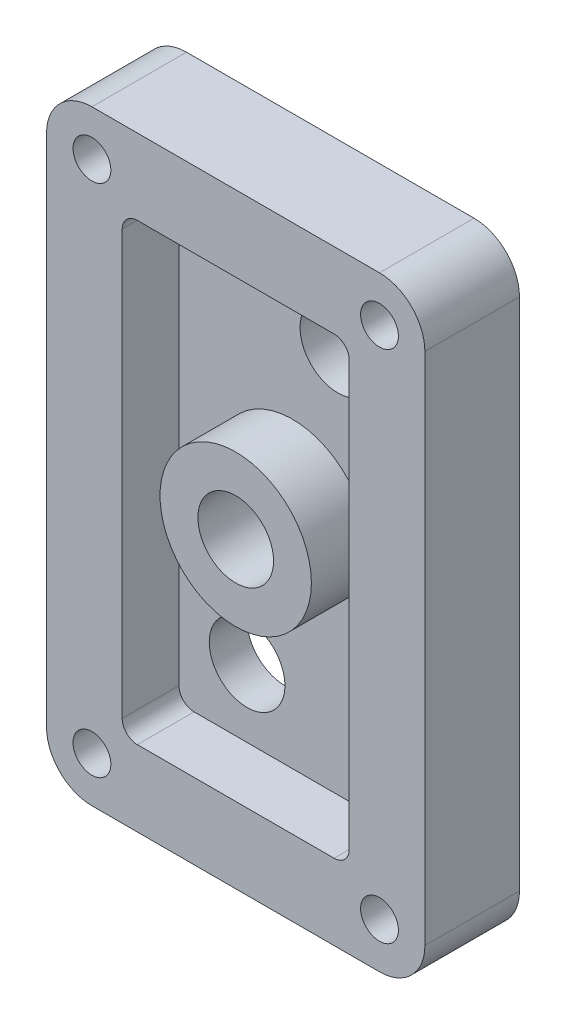
ISO-10303-21;
HEADER;
FILE_DESCRIPTION(('STEP AP214'),'2;1');
FILE_NAME('part.step','',(''),(''),'','','');
FILE_SCHEMA(('AUTOMOTIVE_DESIGN { 1 0 10303 214 1 1 1 1 }'));
ENDSEC;
DATA;
#1=APPLICATION_CONTEXT('core data for automotive mechanical design processes');
#2=APPLICATION_PROTOCOL_DEFINITION('international standard','automotive_design',2000,#1);
#3=PRODUCT_CONTEXT('',#1,'mechanical');
#4=PRODUCT('Part','Part','',(#3));
#5=PRODUCT_RELATED_PRODUCT_CATEGORY('part','',(#4));
#6=PRODUCT_DEFINITION_FORMATION('','',#4);
#7=PRODUCT_DEFINITION_CONTEXT('part definition',#1,'design');
#8=PRODUCT_DEFINITION('design','',#6,#7);
#9=PRODUCT_DEFINITION_SHAPE('','',#8);
#10=(LENGTH_UNIT() NAMED_UNIT(*) SI_UNIT(.MILLI.,.METRE.));
#11=(NAMED_UNIT(*) PLANE_ANGLE_UNIT() SI_UNIT($,.RADIAN.));
#12=(NAMED_UNIT(*) SI_UNIT($,.STERADIAN.) SOLID_ANGLE_UNIT());
#13=UNCERTAINTY_MEASURE_WITH_UNIT(LENGTH_MEASURE(1.E-05),#10,'distance_accuracy_value','');
#14=(GEOMETRIC_REPRESENTATION_CONTEXT(3) GLOBAL_UNCERTAINTY_ASSIGNED_CONTEXT((#13)) GLOBAL_UNIT_ASSIGNED_CONTEXT((#10,
#11,#12)) REPRESENTATION_CONTEXT('',''));
#15=CARTESIAN_POINT('',(0.,0.,0.));
#16=DIRECTION('',(0.,0.,1.));
#17=DIRECTION('',(1.,0.,0.));
#18=AXIS2_PLACEMENT_3D('',#15,#16,#17);
#19=CARTESIAN_POINT('',(0.,0.,250.));
#20=DIRECTION('',(0.,0.,1.));
#21=DIRECTION('',(1.,0.,0.));
#22=AXIS2_PLACEMENT_3D('',#19,#20,#21);
#23=PLANE('',#22);
#24=CARTESIAN_POINT('',(500.,800.,250.));
#25=DIRECTION('',(0.,0.,1.));
#26=DIRECTION('',(1.,0.,0.));
#27=AXIS2_PLACEMENT_3D('',#24,#25,#26);
#28=CIRCLE('',#27,100.);
#29=CARTESIAN_POINT('',(600.,800.,250.));
#30=VERTEX_POINT('',#29);
#31=EDGE_CURVE('E294',#30,#30,#28,.T.);
#32=ORIENTED_EDGE('',*,*,#31,.F.);
#33=EDGE_LOOP('',(#32));
#34=FACE_BOUND('',#33,.T.);
#35=CARTESIAN_POINT('',(500.,800.,250.));
#36=DIRECTION('',(0.,0.,1.));
#37=DIRECTION('',(1.,0.,0.));
#38=AXIS2_PLACEMENT_3D('',#35,#36,#37);
#39=CIRCLE('',#38,200.);
#40=CARTESIAN_POINT('',(700.,800.,250.));
#41=VERTEX_POINT('',#40);
#42=EDGE_CURVE('E190',#41,#41,#39,.T.);
#43=ORIENTED_EDGE('',*,*,#42,.T.);
#44=EDGE_LOOP('',(#43));
#45=FACE_BOUND('',#44,.T.);
#46=ADVANCED_FACE('F41',(#34,#45),#23,.T.);
#47=CARTESIAN_POINT('',(0.,0.,250.));
#48=DIRECTION('',(0.,1.,0.));
#49=DIRECTION('',(0.,0.,1.));
#50=AXIS2_PLACEMENT_3D('',#47,#48,#49);
#51=PLANE('',#50);
#52=DIRECTION('',(1.,0.,0.));
#53=VECTOR('',#52,1.);
#54=CARTESIAN_POINT('',(0.,0.,250.));
#55=LINE('',#54,#53);
#56=CARTESIAN_POINT('',(120.,0.,250.));
#57=VERTEX_POINT('',#56);
#58=CARTESIAN_POINT('',(880.,0.,250.));
#59=VERTEX_POINT('',#58);
#60=EDGE_CURVE('E272',#57,#59,#55,.T.);
#61=ORIENTED_EDGE('',*,*,#60,.F.);
#62=DIRECTION('',(0.,0.,-1.));
#63=VECTOR('',#62,1.);
#64=CARTESIAN_POINT('',(120.,0.,0.));
#65=LINE('',#64,#63);
#66=CARTESIAN_POINT('',(120.,0.,0.));
#67=VERTEX_POINT('',#66);
#68=EDGE_CURVE('E346',#57,#67,#65,.T.);
#69=ORIENTED_EDGE('',*,*,#68,.T.);
#70=DIRECTION('',(1.,0.,0.));
#71=VECTOR('',#70,1.);
#72=CARTESIAN_POINT('',(0.,0.,0.));
#73=LINE('',#72,#71);
#74=CARTESIAN_POINT('',(880.,0.,0.));
#75=VERTEX_POINT('',#74);
#76=EDGE_CURVE('E306',#67,#75,#73,.T.);
#77=ORIENTED_EDGE('',*,*,#76,.T.);
#78=DIRECTION('',(0.,0.,-1.));
#79=VECTOR('',#78,1.);
#80=CARTESIAN_POINT('',(880.,0.,250.));
#81=LINE('',#80,#79);
#82=EDGE_CURVE('E298',#75,#59,#81,.F.);
#83=ORIENTED_EDGE('',*,*,#82,.T.);
#84=EDGE_LOOP('',(#61,#69,#77,#83));
#85=FACE_BOUND('',#84,.T.);
#86=ADVANCED_FACE('F413',(#85),#51,.F.);
#87=CARTESIAN_POINT('',(1000.,0.,250.));
#88=DIRECTION('',(-1.,0.,0.));
#89=DIRECTION('',(0.,-1.,0.));
#90=AXIS2_PLACEMENT_3D('',#87,#88,#89);
#91=PLANE('',#90);
#92=DIRECTION('',(0.,1.,0.));
#93=VECTOR('',#92,1.);
#94=CARTESIAN_POINT('',(1000.,0.,250.));
#95=LINE('',#94,#93);
#96=CARTESIAN_POINT('',(1000.,120.,250.));
#97=VERTEX_POINT('',#96);
#98=CARTESIAN_POINT('',(1000.,1480.,250.));
#99=VERTEX_POINT('',#98);
#100=EDGE_CURVE('E276',#97,#99,#95,.T.);
#101=ORIENTED_EDGE('',*,*,#100,.F.);
#102=DIRECTION('',(0.,0.,-1.));
#103=VECTOR('',#102,1.);
#104=CARTESIAN_POINT('',(1000.,120.,250.));
#105=LINE('',#104,#103);
#106=CARTESIAN_POINT('',(1000.,120.,0.));
#107=VERTEX_POINT('',#106);
#108=EDGE_CURVE('E383',#97,#107,#105,.T.);
#109=ORIENTED_EDGE('',*,*,#108,.T.);
#110=DIRECTION('',(0.,1.,0.));
#111=VECTOR('',#110,1.);
#112=CARTESIAN_POINT('',(1000.,0.,0.));
#113=LINE('',#112,#111);
#114=CARTESIAN_POINT('',(1000.,1480.,0.));
#115=VERTEX_POINT('',#114);
#116=EDGE_CURVE('E310',#107,#115,#113,.T.);
#117=ORIENTED_EDGE('',*,*,#116,.T.);
#118=DIRECTION('',(0.,0.,-1.));
#119=VECTOR('',#118,1.);
#120=CARTESIAN_POINT('',(1000.,1480.,250.));
#121=LINE('',#120,#119);
#122=EDGE_CURVE('E380',#115,#99,#121,.F.);
#123=ORIENTED_EDGE('',*,*,#122,.T.);
#124=EDGE_LOOP('',(#101,#109,#117,#123));
#125=FACE_BOUND('',#124,.T.);
#126=ADVANCED_FACE('F421',(#125),#91,.F.);
#127=CARTESIAN_POINT('',(0.,1600.,250.));
#128=DIRECTION('',(0.,1.,0.));
#129=DIRECTION('',(0.,0.,1.));
#130=AXIS2_PLACEMENT_3D('',#127,#128,#129);
#131=PLANE('',#130);
#132=DIRECTION('',(1.,0.,0.));
#133=VECTOR('',#132,1.);
#134=CARTESIAN_POINT('',(0.,1600.,0.));
#135=LINE('',#134,#133);
#136=CARTESIAN_POINT('',(120.,1600.,0.));
#137=VERTEX_POINT('',#136);
#138=CARTESIAN_POINT('',(880.,1600.,0.));
#139=VERTEX_POINT('',#138);
#140=EDGE_CURVE('E314',#137,#139,#135,.T.);
#141=ORIENTED_EDGE('',*,*,#140,.F.);
#142=DIRECTION('',(0.,0.,-1.));
#143=VECTOR('',#142,1.);
#144=CARTESIAN_POINT('',(120.,1600.,250.));
#145=LINE('',#144,#143);
#146=CARTESIAN_POINT('',(120.,1600.,250.));
#147=VERTEX_POINT('',#146);
#148=EDGE_CURVE('E11',#137,#147,#145,.F.);
#149=ORIENTED_EDGE('',*,*,#148,.T.);
#150=DIRECTION('',(1.,0.,0.));
#151=VECTOR('',#150,1.);
#152=CARTESIAN_POINT('',(0.,1600.,250.));
#153=LINE('',#152,#151);
#154=CARTESIAN_POINT('',(880.,1600.,250.));
#155=VERTEX_POINT('',#154);
#156=EDGE_CURVE('E279',#147,#155,#153,.T.);
#157=ORIENTED_EDGE('',*,*,#156,.T.);
#158=DIRECTION('',(0.,0.,-1.));
#159=VECTOR('',#158,1.);
#160=CARTESIAN_POINT('',(880.,1600.,0.));
#161=LINE('',#160,#159);
#162=EDGE_CURVE('E50',#155,#139,#161,.T.);
#163=ORIENTED_EDGE('',*,*,#162,.T.);
#164=EDGE_LOOP('',(#141,#149,#157,#163));
#165=FACE_BOUND('',#164,.T.);
#166=ADVANCED_FACE('F389',(#165),#131,.T.);
#167=CARTESIAN_POINT('',(380.,380.,250.));
#168=DIRECTION('',(0.,0.,-1.));
#169=DIRECTION('',(-1.,0.,0.));
#170=AXIS2_PLACEMENT_3D('',#167,#168,#169);
#171=CYLINDRICAL_SURFACE('',#170,100.);
#172=CARTESIAN_POINT('',(380.,380.,100.));
#173=DIRECTION('',(0.,0.,-1.));
#174=DIRECTION('',(-1.,0.,0.));
#175=AXIS2_PLACEMENT_3D('',#172,#173,#174);
#176=CIRCLE('',#175,100.);
#177=CARTESIAN_POINT('',(280.,380.,100.));
#178=VERTEX_POINT('',#177);
#179=EDGE_CURVE('E258',#178,#178,#176,.T.);
#180=ORIENTED_EDGE('',*,*,#179,.F.);
#181=EDGE_LOOP('',(#180));
#182=FACE_BOUND('',#181,.T.);
#183=CARTESIAN_POINT('',(380.,380.,0.));
#184=DIRECTION('',(0.,0.,1.));
#185=DIRECTION('',(1.,0.,0.));
#186=AXIS2_PLACEMENT_3D('',#183,#184,#185);
#187=CIRCLE('',#186,100.);
#188=CARTESIAN_POINT('',(480.,380.,0.));
#189=VERTEX_POINT('',#188);
#190=EDGE_CURVE('E334',#189,#189,#187,.T.);
#191=ORIENTED_EDGE('',*,*,#190,.F.);
#192=EDGE_LOOP('',(#191));
#193=FACE_BOUND('',#192,.T.);
#194=ADVANCED_FACE('F596',(#182,#193),#171,.F.);
#195=CARTESIAN_POINT('',(620.,1220.,250.));
#196=DIRECTION('',(0.,0.,-1.));
#197=DIRECTION('',(-1.,0.,0.));
#198=AXIS2_PLACEMENT_3D('',#195,#196,#197);
#199=CYLINDRICAL_SURFACE('',#198,100.);
#200=CARTESIAN_POINT('',(620.,1220.,100.));
#201=DIRECTION('',(0.,0.,-1.));
#202=DIRECTION('',(-1.,0.,0.));
#203=AXIS2_PLACEMENT_3D('',#200,#201,#202);
#204=CIRCLE('',#203,100.);
#205=CARTESIAN_POINT('',(520.,1220.,100.));
#206=VERTEX_POINT('',#205);
#207=EDGE_CURVE('E240',#206,#206,#204,.T.);
#208=ORIENTED_EDGE('',*,*,#207,.F.);
#209=EDGE_LOOP('',(#208));
#210=FACE_BOUND('',#209,.T.);
#211=CARTESIAN_POINT('',(620.,1220.,0.));
#212=DIRECTION('',(0.,0.,1.));
#213=DIRECTION('',(1.,0.,0.));
#214=AXIS2_PLACEMENT_3D('',#211,#212,#213);
#215=CIRCLE('',#214,100.);
#216=CARTESIAN_POINT('',(720.,1220.,0.));
#217=VERTEX_POINT('',#216);
#218=EDGE_CURVE('E330',#217,#217,#215,.T.);
#219=ORIENTED_EDGE('',*,*,#218,.F.);
#220=EDGE_LOOP('',(#219));
#221=FACE_BOUND('',#220,.T.);
#222=ADVANCED_FACE('F600',(#210,#221),#199,.F.);
#223=CARTESIAN_POINT('',(120.,120.,250.));
#224=DIRECTION('',(0.,0.,-1.));
#225=DIRECTION('',(-1.,0.,0.));
#226=AXIS2_PLACEMENT_3D('',#223,#224,#225);
#227=CYLINDRICAL_SURFACE('',#226,50.);
#228=CARTESIAN_POINT('',(120.,120.,250.));
#229=DIRECTION('',(0.,0.,1.));
#230=DIRECTION('',(1.,0.,0.));
#231=AXIS2_PLACEMENT_3D('',#228,#229,#230);
#232=CIRCLE('',#231,50.);
#233=CARTESIAN_POINT('',(170.,120.,250.));
#234=VERTEX_POINT('',#233);
#235=EDGE_CURVE('E290',#234,#234,#232,.F.);
#236=ORIENTED_EDGE('',*,*,#235,.F.);
#237=EDGE_LOOP('',(#236));
#238=FACE_BOUND('',#237,.T.);
#239=CARTESIAN_POINT('',(120.,120.,0.));
#240=DIRECTION('',(0.,0.,1.));
#241=DIRECTION('',(1.,0.,0.));
#242=AXIS2_PLACEMENT_3D('',#239,#240,#241);
#243=CIRCLE('',#242,50.);
#244=CARTESIAN_POINT('',(170.,120.,0.));
#245=VERTEX_POINT('',#244);
#246=EDGE_CURVE('E326',#245,#245,#243,.F.);
#247=ORIENTED_EDGE('',*,*,#246,.T.);
#248=EDGE_LOOP('',(#247));
#249=FACE_BOUND('',#248,.T.);
#250=ADVANCED_FACE('F611',(#238,#249),#227,.F.);
#251=CARTESIAN_POINT('',(880.,120.,250.));
#252=DIRECTION('',(0.,0.,-1.));
#253=DIRECTION('',(-1.,0.,0.));
#254=AXIS2_PLACEMENT_3D('',#251,#252,#253);
#255=CYLINDRICAL_SURFACE('',#254,50.);
#256=CARTESIAN_POINT('',(880.,120.,250.));
#257=DIRECTION('',(0.,0.,1.));
#258=DIRECTION('',(1.,0.,0.));
#259=AXIS2_PLACEMENT_3D('',#256,#257,#258);
#260=CIRCLE('',#259,50.);
#261=CARTESIAN_POINT('',(930.,120.,250.));
#262=VERTEX_POINT('',#261);
#263=EDGE_CURVE('E286',#262,#262,#260,.T.);
#264=ORIENTED_EDGE('',*,*,#263,.T.);
#265=EDGE_LOOP('',(#264));
#266=FACE_BOUND('',#265,.T.);
#267=CARTESIAN_POINT('',(880.,120.,0.));
#268=DIRECTION('',(0.,0.,1.));
#269=DIRECTION('',(1.,0.,0.));
#270=AXIS2_PLACEMENT_3D('',#267,#268,#269);
#271=CIRCLE('',#270,50.);
#272=CARTESIAN_POINT('',(930.,120.,0.));
#273=VERTEX_POINT('',#272);
#274=EDGE_CURVE('E322',#273,#273,#271,.T.);
#275=ORIENTED_EDGE('',*,*,#274,.F.);
#276=EDGE_LOOP('',(#275));
#277=FACE_BOUND('',#276,.T.);
#278=ADVANCED_FACE('F467',(#266,#277),#255,.F.);
#279=CARTESIAN_POINT('',(0.,0.,250.));
#280=DIRECTION('',(-1.,0.,0.));
#281=DIRECTION('',(0.,0.,1.));
#282=AXIS2_PLACEMENT_3D('',#279,#280,#281);
#283=PLANE('',#282);
#284=DIRECTION('',(0.,1.,0.));
#285=VECTOR('',#284,1.);
#286=CARTESIAN_POINT('',(0.,0.,0.));
#287=LINE('',#286,#285);
#288=CARTESIAN_POINT('',(0.,120.,0.));
#289=VERTEX_POINT('',#288);
#290=CARTESIAN_POINT('',(0.,1480.,0.));
#291=VERTEX_POINT('',#290);
#292=EDGE_CURVE('E318',#289,#291,#287,.T.);
#293=ORIENTED_EDGE('',*,*,#292,.F.);
#294=DIRECTION('',(0.,0.,-1.));
#295=VECTOR('',#294,1.);
#296=CARTESIAN_POINT('',(0.,120.,250.));
#297=LINE('',#296,#295);
#298=CARTESIAN_POINT('',(0.,120.,250.));
#299=VERTEX_POINT('',#298);
#300=EDGE_CURVE('E366',#289,#299,#297,.F.);
#301=ORIENTED_EDGE('',*,*,#300,.T.);
#302=DIRECTION('',(0.,1.,0.));
#303=VECTOR('',#302,1.);
#304=CARTESIAN_POINT('',(0.,0.,250.));
#305=LINE('',#304,#303);
#306=CARTESIAN_POINT('',(0.,1480.,250.));
#307=VERTEX_POINT('',#306);
#308=EDGE_CURVE('E282',#299,#307,#305,.T.);
#309=ORIENTED_EDGE('',*,*,#308,.T.);
#310=DIRECTION('',(0.,0.,-1.));
#311=VECTOR('',#310,1.);
#312=CARTESIAN_POINT('',(0.,1480.,250.));
#313=LINE('',#312,#311);
#314=EDGE_CURVE('E362',#307,#291,#313,.T.);
#315=ORIENTED_EDGE('',*,*,#314,.T.);
#316=EDGE_LOOP('',(#293,#301,#309,#315));
#317=FACE_BOUND('',#316,.T.);
#318=ADVANCED_FACE('F402',(#317),#283,.T.);
#319=CARTESIAN_POINT('',(120.,1480.,250.));
#320=DIRECTION('',(0.,0.,-1.));
#321=DIRECTION('',(-1.,0.,0.));
#322=AXIS2_PLACEMENT_3D('',#319,#320,#321);
#323=CYLINDRICAL_SURFACE('',#322,50.);
#324=CARTESIAN_POINT('',(120.,1480.,250.));
#325=DIRECTION('',(0.,0.,1.));
#326=DIRECTION('',(1.,0.,0.));
#327=AXIS2_PLACEMENT_3D('',#324,#325,#326);
#328=CIRCLE('',#327,50.);
#329=CARTESIAN_POINT('',(170.,1480.,250.));
#330=VERTEX_POINT('',#329);
#331=EDGE_CURVE('E267',#330,#330,#328,.T.);
#332=ORIENTED_EDGE('',*,*,#331,.T.);
#333=EDGE_LOOP('',(#332));
#334=FACE_BOUND('',#333,.T.);
#335=CARTESIAN_POINT('',(120.,1480.,0.));
#336=DIRECTION('',(0.,0.,1.));
#337=DIRECTION('',(1.,0.,0.));
#338=AXIS2_PLACEMENT_3D('',#335,#336,#337);
#339=CIRCLE('',#338,50.);
#340=CARTESIAN_POINT('',(170.,1480.,0.));
#341=VERTEX_POINT('',#340);
#342=EDGE_CURVE('E302',#341,#341,#339,.T.);
#343=ORIENTED_EDGE('',*,*,#342,.F.);
#344=EDGE_LOOP('',(#343));
#345=FACE_BOUND('',#344,.T.);
#346=ADVANCED_FACE('F455',(#334,#345),#323,.F.);
#347=CARTESIAN_POINT('',(880.,1480.,250.));
#348=DIRECTION('',(0.,0.,-1.));
#349=DIRECTION('',(-1.,0.,0.));
#350=AXIS2_PLACEMENT_3D('',#347,#348,#349);
#351=CYLINDRICAL_SURFACE('',#350,50.);
#352=CARTESIAN_POINT('',(880.,1480.,250.));
#353=DIRECTION('',(0.,0.,1.));
#354=DIRECTION('',(1.,0.,0.));
#355=AXIS2_PLACEMENT_3D('',#352,#353,#354);
#356=CIRCLE('',#355,50.);
#357=CARTESIAN_POINT('',(930.,1480.,250.));
#358=VERTEX_POINT('',#357);
#359=EDGE_CURVE('E263',#358,#358,#356,.F.);
#360=ORIENTED_EDGE('',*,*,#359,.F.);
#361=EDGE_LOOP('',(#360));
#362=FACE_BOUND('',#361,.T.);
#363=CARTESIAN_POINT('',(880.,1480.,0.));
#364=DIRECTION('',(0.,0.,1.));
#365=DIRECTION('',(1.,0.,0.));
#366=AXIS2_PLACEMENT_3D('',#363,#364,#365);
#367=CIRCLE('',#366,50.);
#368=CARTESIAN_POINT('',(930.,1480.,0.));
#369=VERTEX_POINT('',#368);
#370=EDGE_CURVE('E262',#369,#369,#367,.F.);
#371=ORIENTED_EDGE('',*,*,#370,.T.);
#372=EDGE_LOOP('',(#371));
#373=FACE_BOUND('',#372,.T.);
#374=ADVANCED_FACE('F446',(#362,#373),#351,.F.);
#375=CARTESIAN_POINT('',(500.,800.,250.));
#376=DIRECTION('',(0.,0.,-1.));
#377=DIRECTION('',(-1.,0.,0.));
#378=AXIS2_PLACEMENT_3D('',#375,#376,#377);
#379=CYLINDRICAL_SURFACE('',#378,100.);
#380=ORIENTED_EDGE('',*,*,#31,.T.);
#381=EDGE_LOOP('',(#380));
#382=FACE_BOUND('',#381,.T.);
#383=CARTESIAN_POINT('',(500.,800.,0.));
#384=DIRECTION('',(0.,0.,1.));
#385=DIRECTION('',(1.,0.,0.));
#386=AXIS2_PLACEMENT_3D('',#383,#384,#385);
#387=CIRCLE('',#386,100.);
#388=CARTESIAN_POINT('',(600.,800.,0.));
#389=VERTEX_POINT('',#388);
#390=EDGE_CURVE('E268',#389,#389,#387,.T.);
#391=ORIENTED_EDGE('',*,*,#390,.F.);
#392=EDGE_LOOP('',(#391));
#393=FACE_BOUND('',#392,.T.);
#394=ADVANCED_FACE('F439',(#382,#393),#379,.F.);
#395=CARTESIAN_POINT('',(240.,1360.,250.));
#396=DIRECTION('',(0.,0.,1.));
#397=DIRECTION('',(-1.,0.,0.));
#398=AXIS2_PLACEMENT_3D('',#395,#396,#397);
#399=CIRCLE('',#398,40.);
#400=CARTESIAN_POINT('',(240.,1400.,250.));
#401=VERTEX_POINT('',#400);
#402=CARTESIAN_POINT('',(200.,1360.,250.));
#403=VERTEX_POINT('',#402);
#404=EDGE_CURVE('E162',#401,#403,#399,.T.);
#405=ORIENTED_EDGE('',*,*,#404,.F.);
#406=DIRECTION('',(-1.,0.,0.));
#407=VECTOR('',#406,1.);
#408=CARTESIAN_POINT('',(240.,1400.,250.));
#409=LINE('',#408,#407);
#410=CARTESIAN_POINT('',(760.,1400.,250.));
#411=VERTEX_POINT('',#410);
#412=EDGE_CURVE('E183',#411,#401,#409,.T.);
#413=ORIENTED_EDGE('',*,*,#412,.F.);
#414=CARTESIAN_POINT('',(760.,1360.,250.));
#415=DIRECTION('',(0.,0.,1.));
#416=DIRECTION('',(1.,0.,0.));
#417=AXIS2_PLACEMENT_3D('',#414,#415,#416);
#418=CIRCLE('',#417,40.);
#419=CARTESIAN_POINT('',(800.,1360.,250.));
#420=VERTEX_POINT('',#419);
#421=EDGE_CURVE('E187',#420,#411,#418,.T.);
#422=ORIENTED_EDGE('',*,*,#421,.F.);
#423=DIRECTION('',(0.,1.,0.));
#424=VECTOR('',#423,1.);
#425=CARTESIAN_POINT('',(800.,1360.,250.));
#426=LINE('',#425,#424);
#427=CARTESIAN_POINT('',(800.,240.,250.));
#428=VERTEX_POINT('',#427);
#429=EDGE_CURVE('E230',#428,#420,#426,.T.);
#430=ORIENTED_EDGE('',*,*,#429,.F.);
#431=CARTESIAN_POINT('',(760.,240.,250.));
#432=DIRECTION('',(0.,0.,1.));
#433=DIRECTION('',(1.,0.,0.));
#434=AXIS2_PLACEMENT_3D('',#431,#432,#433);
#435=CIRCLE('',#434,40.);
#436=CARTESIAN_POINT('',(760.,200.,250.));
#437=VERTEX_POINT('',#436);
#438=EDGE_CURVE('E226',#437,#428,#435,.T.);
#439=ORIENTED_EDGE('',*,*,#438,.F.);
#440=DIRECTION('',(1.,0.,0.));
#441=VECTOR('',#440,1.);
#442=CARTESIAN_POINT('',(240.,200.,250.));
#443=LINE('',#442,#441);
#444=CARTESIAN_POINT('',(240.,200.,250.));
#445=VERTEX_POINT('',#444);
#446=EDGE_CURVE('E222',#445,#437,#443,.T.);
#447=ORIENTED_EDGE('',*,*,#446,.F.);
#448=CARTESIAN_POINT('',(240.,240.,250.));
#449=DIRECTION('',(0.,0.,1.));
#450=DIRECTION('',(1.,0.,0.));
#451=AXIS2_PLACEMENT_3D('',#448,#449,#450);
#452=CIRCLE('',#451,40.);
#453=CARTESIAN_POINT('',(200.,240.,250.));
#454=VERTEX_POINT('',#453);
#455=EDGE_CURVE('E218',#454,#445,#452,.T.);
#456=ORIENTED_EDGE('',*,*,#455,.F.);
#457=DIRECTION('',(0.,-1.,0.));
#458=VECTOR('',#457,1.);
#459=CARTESIAN_POINT('',(200.,1360.,250.));
#460=LINE('',#459,#458);
#461=EDGE_CURVE('E214',#403,#454,#460,.T.);
#462=ORIENTED_EDGE('',*,*,#461,.F.);
#463=EDGE_LOOP('',(#405,#413,#422,#430,#439,#447,#456,#462));
#464=FACE_BOUND('',#463,.T.);
#465=ORIENTED_EDGE('',*,*,#359,.T.);
#466=EDGE_LOOP('',(#465));
#467=FACE_BOUND('',#466,.T.);
#468=ORIENTED_EDGE('',*,*,#331,.F.);
#469=EDGE_LOOP('',(#468));
#470=FACE_BOUND('',#469,.T.);
#471=ORIENTED_EDGE('',*,*,#308,.F.);
#472=CARTESIAN_POINT('',(120.,120.,250.));
#473=DIRECTION('',(0.,0.,1.));
#474=DIRECTION('',(1.,0.,0.));
#475=AXIS2_PLACEMENT_3D('',#472,#473,#474);
#476=CIRCLE('',#475,120.);
#477=EDGE_CURVE('E377',#299,#57,#476,.T.);
#478=ORIENTED_EDGE('',*,*,#477,.T.);
#479=ORIENTED_EDGE('',*,*,#60,.T.);
#480=CARTESIAN_POINT('',(880.,120.,250.));
#481=DIRECTION('',(0.,0.,1.));
#482=DIRECTION('',(1.,0.,0.));
#483=AXIS2_PLACEMENT_3D('',#480,#481,#482);
#484=CIRCLE('',#483,120.);
#485=EDGE_CURVE('E374',#59,#97,#484,.T.);
#486=ORIENTED_EDGE('',*,*,#485,.T.);
#487=ORIENTED_EDGE('',*,*,#100,.T.);
#488=CARTESIAN_POINT('',(880.,1480.,250.));
#489=DIRECTION('',(0.,0.,1.));
#490=DIRECTION('',(1.,0.,0.));
#491=AXIS2_PLACEMENT_3D('',#488,#489,#490);
#492=CIRCLE('',#491,120.);
#493=EDGE_CURVE('E57',#99,#155,#492,.T.);
#494=ORIENTED_EDGE('',*,*,#493,.T.);
#495=ORIENTED_EDGE('',*,*,#156,.F.);
#496=CARTESIAN_POINT('',(120.,1480.,250.));
#497=DIRECTION('',(0.,0.,1.));
#498=DIRECTION('',(1.,0.,0.));
#499=AXIS2_PLACEMENT_3D('',#496,#497,#498);
#500=CIRCLE('',#499,120.);
#501=EDGE_CURVE('E371',#147,#307,#500,.T.);
#502=ORIENTED_EDGE('',*,*,#501,.T.);
#503=EDGE_LOOP('',(#471,#478,#479,#486,#487,#494,#495,#502));
#504=FACE_BOUND('',#503,.T.);
#505=ORIENTED_EDGE('',*,*,#263,.F.);
#506=EDGE_LOOP('',(#505));
#507=FACE_BOUND('',#506,.T.);
#508=ORIENTED_EDGE('',*,*,#235,.T.);
#509=EDGE_LOOP('',(#508));
#510=FACE_BOUND('',#509,.T.);
#511=ADVANCED_FACE('F406',(#464,#467,#470,#504,#507,#510),#23,.T.);
#512=CARTESIAN_POINT('',(0.,0.,0.));
#513=DIRECTION('',(0.,0.,1.));
#514=DIRECTION('',(1.,0.,0.));
#515=AXIS2_PLACEMENT_3D('',#512,#513,#514);
#516=PLANE('',#515);
#517=ORIENTED_EDGE('',*,*,#370,.F.);
#518=EDGE_LOOP('',(#517));
#519=FACE_BOUND('',#518,.T.);
#520=ORIENTED_EDGE('',*,*,#342,.T.);
#521=EDGE_LOOP('',(#520));
#522=FACE_BOUND('',#521,.T.);
#523=ORIENTED_EDGE('',*,*,#76,.F.);
#524=CARTESIAN_POINT('',(120.,120.,0.));
#525=DIRECTION('',(0.,0.,1.));
#526=DIRECTION('',(1.,0.,0.));
#527=AXIS2_PLACEMENT_3D('',#524,#525,#526);
#528=CIRCLE('',#527,120.);
#529=EDGE_CURVE('E359',#67,#289,#528,.F.);
#530=ORIENTED_EDGE('',*,*,#529,.T.);
#531=ORIENTED_EDGE('',*,*,#292,.T.);
#532=CARTESIAN_POINT('',(120.,1480.,0.));
#533=DIRECTION('',(0.,0.,1.));
#534=DIRECTION('',(1.,0.,0.));
#535=AXIS2_PLACEMENT_3D('',#532,#533,#534);
#536=CIRCLE('',#535,120.);
#537=EDGE_CURVE('E353',#291,#137,#536,.F.);
#538=ORIENTED_EDGE('',*,*,#537,.T.);
#539=ORIENTED_EDGE('',*,*,#140,.T.);
#540=CARTESIAN_POINT('',(880.,1480.,0.));
#541=DIRECTION('',(0.,0.,1.));
#542=DIRECTION('',(1.,0.,0.));
#543=AXIS2_PLACEMENT_3D('',#540,#541,#542);
#544=CIRCLE('',#543,120.);
#545=EDGE_CURVE('E350',#139,#115,#544,.F.);
#546=ORIENTED_EDGE('',*,*,#545,.T.);
#547=ORIENTED_EDGE('',*,*,#116,.F.);
#548=CARTESIAN_POINT('',(880.,120.,0.));
#549=DIRECTION('',(0.,0.,1.));
#550=DIRECTION('',(1.,0.,0.));
#551=AXIS2_PLACEMENT_3D('',#548,#549,#550);
#552=CIRCLE('',#551,120.);
#553=EDGE_CURVE('E356',#107,#75,#552,.F.);
#554=ORIENTED_EDGE('',*,*,#553,.T.);
#555=EDGE_LOOP('',(#523,#530,#531,#538,#539,#546,#547,#554));
#556=FACE_BOUND('',#555,.T.);
#557=ORIENTED_EDGE('',*,*,#274,.T.);
#558=EDGE_LOOP('',(#557));
#559=FACE_BOUND('',#558,.T.);
#560=ORIENTED_EDGE('',*,*,#246,.F.);
#561=EDGE_LOOP('',(#560));
#562=FACE_BOUND('',#561,.T.);
#563=ORIENTED_EDGE('',*,*,#218,.T.);
#564=EDGE_LOOP('',(#563));
#565=FACE_BOUND('',#564,.T.);
#566=ORIENTED_EDGE('',*,*,#190,.T.);
#567=EDGE_LOOP('',(#566));
#568=FACE_BOUND('',#567,.T.);
#569=ORIENTED_EDGE('',*,*,#390,.T.);
#570=EDGE_LOOP('',(#569));
#571=FACE_BOUND('',#570,.T.);
#572=ADVANCED_FACE('F393',(#519,#522,#556,#559,#562,#565,#568,#571),#516,.F.);
#573=CARTESIAN_POINT('',(240.,1360.,100.));
#574=DIRECTION('',(0.,0.,1.));
#575=DIRECTION('',(1.,0.,0.));
#576=AXIS2_PLACEMENT_3D('',#573,#574,#575);
#577=CYLINDRICAL_SURFACE('',#576,40.);
#578=ORIENTED_EDGE('',*,*,#404,.T.);
#579=DIRECTION('',(0.,0.,1.));
#580=VECTOR('',#579,1.);
#581=CARTESIAN_POINT('',(200.,1360.,100.));
#582=LINE('',#581,#580);
#583=CARTESIAN_POINT('',(200.,1360.,100.));
#584=VERTEX_POINT('',#583);
#585=EDGE_CURVE('E155',#584,#403,#582,.T.);
#586=ORIENTED_EDGE('',*,*,#585,.F.);
#587=CARTESIAN_POINT('',(240.,1360.,100.));
#588=DIRECTION('',(0.,0.,1.));
#589=DIRECTION('',(-1.,0.,0.));
#590=AXIS2_PLACEMENT_3D('',#587,#588,#589);
#591=CIRCLE('',#590,40.);
#592=CARTESIAN_POINT('',(240.,1400.,100.));
#593=VERTEX_POINT('',#592);
#594=EDGE_CURVE('E159',#593,#584,#591,.T.);
#595=ORIENTED_EDGE('',*,*,#594,.F.);
#596=DIRECTION('',(0.,0.,1.));
#597=VECTOR('',#596,1.);
#598=CARTESIAN_POINT('',(240.,1400.,100.));
#599=LINE('',#598,#597);
#600=EDGE_CURVE('E237',#593,#401,#599,.T.);
#601=ORIENTED_EDGE('',*,*,#600,.T.);
#602=EDGE_LOOP('',(#578,#586,#595,#601));
#603=FACE_BOUND('',#602,.T.);
#604=ADVANCED_FACE('F157',(#603),#577,.F.);
#605=CARTESIAN_POINT('',(240.,1400.,100.));
#606=DIRECTION('',(0.,1.,0.));
#607=DIRECTION('',(0.,0.,1.));
#608=AXIS2_PLACEMENT_3D('',#605,#606,#607);
#609=PLANE('',#608);
#610=ORIENTED_EDGE('',*,*,#412,.T.);
#611=ORIENTED_EDGE('',*,*,#600,.F.);
#612=DIRECTION('',(-1.,0.,0.));
#613=VECTOR('',#612,1.);
#614=CARTESIAN_POINT('',(240.,1400.,100.));
#615=LINE('',#614,#613);
#616=CARTESIAN_POINT('',(760.,1400.,100.));
#617=VERTEX_POINT('',#616);
#618=EDGE_CURVE('E168',#617,#593,#615,.T.);
#619=ORIENTED_EDGE('',*,*,#618,.F.);
#620=DIRECTION('',(0.,0.,1.));
#621=VECTOR('',#620,1.);
#622=CARTESIAN_POINT('',(760.,1400.,100.));
#623=LINE('',#622,#621);
#624=EDGE_CURVE('E241',#617,#411,#623,.T.);
#625=ORIENTED_EDGE('',*,*,#624,.T.);
#626=EDGE_LOOP('',(#610,#611,#619,#625));
#627=FACE_BOUND('',#626,.T.);
#628=ADVANCED_FACE('F565',(#627),#609,.F.);
#629=CARTESIAN_POINT('',(760.,1360.,100.));
#630=DIRECTION('',(0.,0.,1.));
#631=DIRECTION('',(1.,0.,0.));
#632=AXIS2_PLACEMENT_3D('',#629,#630,#631);
#633=CYLINDRICAL_SURFACE('',#632,40.);
#634=ORIENTED_EDGE('',*,*,#421,.T.);
#635=ORIENTED_EDGE('',*,*,#624,.F.);
#636=CARTESIAN_POINT('',(760.,1360.,100.));
#637=DIRECTION('',(0.,0.,1.));
#638=DIRECTION('',(1.,0.,0.));
#639=AXIS2_PLACEMENT_3D('',#636,#637,#638);
#640=CIRCLE('',#639,40.);
#641=CARTESIAN_POINT('',(800.,1360.,100.));
#642=VERTEX_POINT('',#641);
#643=EDGE_CURVE('E207',#642,#617,#640,.T.);
#644=ORIENTED_EDGE('',*,*,#643,.F.);
#645=DIRECTION('',(0.,0.,1.));
#646=VECTOR('',#645,1.);
#647=CARTESIAN_POINT('',(800.,1360.,100.));
#648=LINE('',#647,#646);
#649=EDGE_CURVE('E244',#642,#420,#648,.T.);
#650=ORIENTED_EDGE('',*,*,#649,.T.);
#651=EDGE_LOOP('',(#634,#635,#644,#650));
#652=FACE_BOUND('',#651,.T.);
#653=ADVANCED_FACE('F556',(#652),#633,.F.);
#654=CARTESIAN_POINT('',(800.,1360.,100.));
#655=DIRECTION('',(1.,0.,0.));
#656=DIRECTION('',(0.,1.,0.));
#657=AXIS2_PLACEMENT_3D('',#654,#655,#656);
#658=PLANE('',#657);
#659=ORIENTED_EDGE('',*,*,#429,.T.);
#660=ORIENTED_EDGE('',*,*,#649,.F.);
#661=DIRECTION('',(0.,1.,0.));
#662=VECTOR('',#661,1.);
#663=CARTESIAN_POINT('',(800.,1360.,100.));
#664=LINE('',#663,#662);
#665=CARTESIAN_POINT('',(800.,240.,100.));
#666=VERTEX_POINT('',#665);
#667=EDGE_CURVE('E203',#666,#642,#664,.T.);
#668=ORIENTED_EDGE('',*,*,#667,.F.);
#669=DIRECTION('',(0.,0.,1.));
#670=VECTOR('',#669,1.);
#671=CARTESIAN_POINT('',(800.,240.,100.));
#672=LINE('',#671,#670);
#673=EDGE_CURVE('E247',#666,#428,#672,.T.);
#674=ORIENTED_EDGE('',*,*,#673,.T.);
#675=EDGE_LOOP('',(#659,#660,#668,#674));
#676=FACE_BOUND('',#675,.T.);
#677=ADVANCED_FACE('F547',(#676),#658,.F.);
#678=CARTESIAN_POINT('',(760.,240.,100.));
#679=DIRECTION('',(0.,0.,1.));
#680=DIRECTION('',(1.,0.,0.));
#681=AXIS2_PLACEMENT_3D('',#678,#679,#680);
#682=CYLINDRICAL_SURFACE('',#681,40.);
#683=ORIENTED_EDGE('',*,*,#438,.T.);
#684=ORIENTED_EDGE('',*,*,#673,.F.);
#685=CARTESIAN_POINT('',(760.,240.,100.));
#686=DIRECTION('',(0.,0.,1.));
#687=DIRECTION('',(1.,0.,0.));
#688=AXIS2_PLACEMENT_3D('',#685,#686,#687);
#689=CIRCLE('',#688,40.);
#690=CARTESIAN_POINT('',(760.,200.,100.));
#691=VERTEX_POINT('',#690);
#692=EDGE_CURVE('E199',#691,#666,#689,.T.);
#693=ORIENTED_EDGE('',*,*,#692,.F.);
#694=DIRECTION('',(0.,0.,1.));
#695=VECTOR('',#694,1.);
#696=CARTESIAN_POINT('',(760.,200.,100.));
#697=LINE('',#696,#695);
#698=EDGE_CURVE('E250',#691,#437,#697,.T.);
#699=ORIENTED_EDGE('',*,*,#698,.T.);
#700=EDGE_LOOP('',(#683,#684,#693,#699));
#701=FACE_BOUND('',#700,.T.);
#702=ADVANCED_FACE('F538',(#701),#682,.F.);
#703=CARTESIAN_POINT('',(240.,200.,100.));
#704=DIRECTION('',(0.,-1.,0.));
#705=DIRECTION('',(1.,0.,0.));
#706=AXIS2_PLACEMENT_3D('',#703,#704,#705);
#707=PLANE('',#706);
#708=ORIENTED_EDGE('',*,*,#446,.T.);
#709=ORIENTED_EDGE('',*,*,#698,.F.);
#710=DIRECTION('',(1.,0.,0.));
#711=VECTOR('',#710,1.);
#712=CARTESIAN_POINT('',(240.,200.,100.));
#713=LINE('',#712,#711);
#714=CARTESIAN_POINT('',(240.,200.,100.));
#715=VERTEX_POINT('',#714);
#716=EDGE_CURVE('E195',#715,#691,#713,.T.);
#717=ORIENTED_EDGE('',*,*,#716,.F.);
#718=DIRECTION('',(0.,0.,1.));
#719=VECTOR('',#718,1.);
#720=CARTESIAN_POINT('',(240.,200.,100.));
#721=LINE('',#720,#719);
#722=EDGE_CURVE('E253',#715,#445,#721,.T.);
#723=ORIENTED_EDGE('',*,*,#722,.T.);
#724=EDGE_LOOP('',(#708,#709,#717,#723));
#725=FACE_BOUND('',#724,.T.);
#726=ADVANCED_FACE('F529',(#725),#707,.F.);
#727=CARTESIAN_POINT('',(240.,240.,100.));
#728=DIRECTION('',(0.,0.,1.));
#729=DIRECTION('',(1.,0.,0.));
#730=AXIS2_PLACEMENT_3D('',#727,#728,#729);
#731=CYLINDRICAL_SURFACE('',#730,40.);
#732=ORIENTED_EDGE('',*,*,#455,.T.);
#733=ORIENTED_EDGE('',*,*,#722,.F.);
#734=CARTESIAN_POINT('',(240.,240.,100.));
#735=DIRECTION('',(0.,0.,1.));
#736=DIRECTION('',(1.,0.,0.));
#737=AXIS2_PLACEMENT_3D('',#734,#735,#736);
#738=CIRCLE('',#737,40.);
#739=CARTESIAN_POINT('',(200.,240.,100.));
#740=VERTEX_POINT('',#739);
#741=EDGE_CURVE('E177',#740,#715,#738,.T.);
#742=ORIENTED_EDGE('',*,*,#741,.F.);
#743=DIRECTION('',(0.,0.,1.));
#744=VECTOR('',#743,1.);
#745=CARTESIAN_POINT('',(200.,240.,100.));
#746=LINE('',#745,#744);
#747=EDGE_CURVE('E167',#740,#454,#746,.T.);
#748=ORIENTED_EDGE('',*,*,#747,.T.);
#749=EDGE_LOOP('',(#732,#733,#742,#748));
#750=FACE_BOUND('',#749,.T.);
#751=ADVANCED_FACE('F521',(#750),#731,.F.);
#752=CARTESIAN_POINT('',(200.,1360.,100.));
#753=DIRECTION('',(-1.,0.,0.));
#754=DIRECTION('',(0.,-1.,0.));
#755=AXIS2_PLACEMENT_3D('',#752,#753,#754);
#756=PLANE('',#755);
#757=ORIENTED_EDGE('',*,*,#461,.T.);
#758=ORIENTED_EDGE('',*,*,#747,.F.);
#759=DIRECTION('',(0.,-1.,0.));
#760=VECTOR('',#759,1.);
#761=CARTESIAN_POINT('',(200.,1360.,100.));
#762=LINE('',#761,#760);
#763=EDGE_CURVE('E171',#584,#740,#762,.T.);
#764=ORIENTED_EDGE('',*,*,#763,.F.);
#765=ORIENTED_EDGE('',*,*,#585,.T.);
#766=EDGE_LOOP('',(#757,#758,#764,#765));
#767=FACE_BOUND('',#766,.T.);
#768=ADVANCED_FACE('F172',(#767),#756,.F.);
#769=CARTESIAN_POINT('',(240.,1360.,100.));
#770=DIRECTION('',(0.,0.,-1.));
#771=DIRECTION('',(-1.,0.,0.));
#772=AXIS2_PLACEMENT_3D('',#769,#770,#771);
#773=PLANE('',#772);
#774=ORIENTED_EDGE('',*,*,#179,.T.);
#775=EDGE_LOOP('',(#774));
#776=FACE_BOUND('',#775,.T.);
#777=ORIENTED_EDGE('',*,*,#207,.T.);
#778=EDGE_LOOP('',(#777));
#779=FACE_BOUND('',#778,.T.);
#780=CARTESIAN_POINT('',(500.,800.,100.));
#781=DIRECTION('',(0.,0.,1.));
#782=DIRECTION('',(1.,0.,0.));
#783=AXIS2_PLACEMENT_3D('',#780,#781,#782);
#784=CIRCLE('',#783,200.);
#785=CARTESIAN_POINT('',(700.,800.,100.));
#786=VERTEX_POINT('',#785);
#787=EDGE_CURVE('E215',#786,#786,#784,.T.);
#788=ORIENTED_EDGE('',*,*,#787,.F.);
#789=EDGE_LOOP('',(#788));
#790=FACE_BOUND('',#789,.T.);
#791=ORIENTED_EDGE('',*,*,#594,.T.);
#792=ORIENTED_EDGE('',*,*,#763,.T.);
#793=ORIENTED_EDGE('',*,*,#741,.T.);
#794=ORIENTED_EDGE('',*,*,#716,.T.);
#795=ORIENTED_EDGE('',*,*,#692,.T.);
#796=ORIENTED_EDGE('',*,*,#667,.T.);
#797=ORIENTED_EDGE('',*,*,#643,.T.);
#798=ORIENTED_EDGE('',*,*,#618,.T.);
#799=EDGE_LOOP('',(#791,#792,#793,#794,#795,#796,#797,#798));
#800=FACE_BOUND('',#799,.T.);
#801=ADVANCED_FACE('F179',(#776,#779,#790,#800),#773,.F.);
#802=CARTESIAN_POINT('',(500.,800.,100.));
#803=DIRECTION('',(0.,0.,1.));
#804=DIRECTION('',(1.,0.,0.));
#805=AXIS2_PLACEMENT_3D('',#802,#803,#804);
#806=CYLINDRICAL_SURFACE('',#805,200.);
#807=ORIENTED_EDGE('',*,*,#787,.T.);
#808=EDGE_LOOP('',(#807));
#809=FACE_BOUND('',#808,.T.);
#810=ORIENTED_EDGE('',*,*,#42,.F.);
#811=EDGE_LOOP('',(#810));
#812=FACE_BOUND('',#811,.T.);
#813=ADVANCED_FACE('F473',(#809,#812),#806,.T.);
#814=CARTESIAN_POINT('',(120.,120.,250.));
#815=DIRECTION('',(0.,0.,1.));
#816=DIRECTION('',(1.,0.,0.));
#817=AXIS2_PLACEMENT_3D('',#814,#815,#816);
#818=CYLINDRICAL_SURFACE('',#817,120.);
#819=ORIENTED_EDGE('',*,*,#477,.F.);
#820=ORIENTED_EDGE('',*,*,#300,.F.);
#821=ORIENTED_EDGE('',*,*,#529,.F.);
#822=ORIENTED_EDGE('',*,*,#68,.F.);
#823=EDGE_LOOP('',(#819,#820,#821,#822));
#824=FACE_BOUND('',#823,.T.);
#825=ADVANCED_FACE('F411',(#824),#818,.T.);
#826=CARTESIAN_POINT('',(880.,120.,250.));
#827=DIRECTION('',(0.,0.,-1.));
#828=DIRECTION('',(-1.,0.,0.));
#829=AXIS2_PLACEMENT_3D('',#826,#827,#828);
#830=CYLINDRICAL_SURFACE('',#829,120.);
#831=ORIENTED_EDGE('',*,*,#485,.F.);
#832=ORIENTED_EDGE('',*,*,#82,.F.);
#833=ORIENTED_EDGE('',*,*,#553,.F.);
#834=ORIENTED_EDGE('',*,*,#108,.F.);
#835=EDGE_LOOP('',(#831,#832,#833,#834));
#836=FACE_BOUND('',#835,.T.);
#837=ADVANCED_FACE('F418',(#836),#830,.T.);
#838=CARTESIAN_POINT('',(120.,1480.,250.));
#839=DIRECTION('',(0.,0.,-1.));
#840=DIRECTION('',(-1.,0.,0.));
#841=AXIS2_PLACEMENT_3D('',#838,#839,#840);
#842=CYLINDRICAL_SURFACE('',#841,120.);
#843=ORIENTED_EDGE('',*,*,#501,.F.);
#844=ORIENTED_EDGE('',*,*,#148,.F.);
#845=ORIENTED_EDGE('',*,*,#537,.F.);
#846=ORIENTED_EDGE('',*,*,#314,.F.);
#847=EDGE_LOOP('',(#843,#844,#845,#846));
#848=FACE_BOUND('',#847,.T.);
#849=ADVANCED_FACE('F400',(#848),#842,.T.);
#850=CARTESIAN_POINT('',(880.,1480.,250.));
#851=DIRECTION('',(0.,0.,1.));
#852=DIRECTION('',(1.,0.,0.));
#853=AXIS2_PLACEMENT_3D('',#850,#851,#852);
#854=CYLINDRICAL_SURFACE('',#853,120.);
#855=ORIENTED_EDGE('',*,*,#493,.F.);
#856=ORIENTED_EDGE('',*,*,#122,.F.);
#857=ORIENTED_EDGE('',*,*,#545,.F.);
#858=ORIENTED_EDGE('',*,*,#162,.F.);
#859=EDGE_LOOP('',(#855,#856,#857,#858));
#860=FACE_BOUND('',#859,.T.);
#861=ADVANCED_FACE('F43',(#860),#854,.T.);
#862=CLOSED_SHELL('',(#46,#86,#126,#166,#194,#222,#250,#278,#318,#346,#374,#394,#511,#572,#604,
#628,#653,#677,#702,#726,#751,#768,#801,#813,#825,#837,#849,#861));
#863=MANIFOLD_SOLID_BREP('B2',#862);
#864=ADVANCED_BREP_SHAPE_REPRESENTATION('',(#18,#863),#14);
#865=SHAPE_DEFINITION_REPRESENTATION(#9,#864);
ENDSEC;
END-ISO-10303-21;
